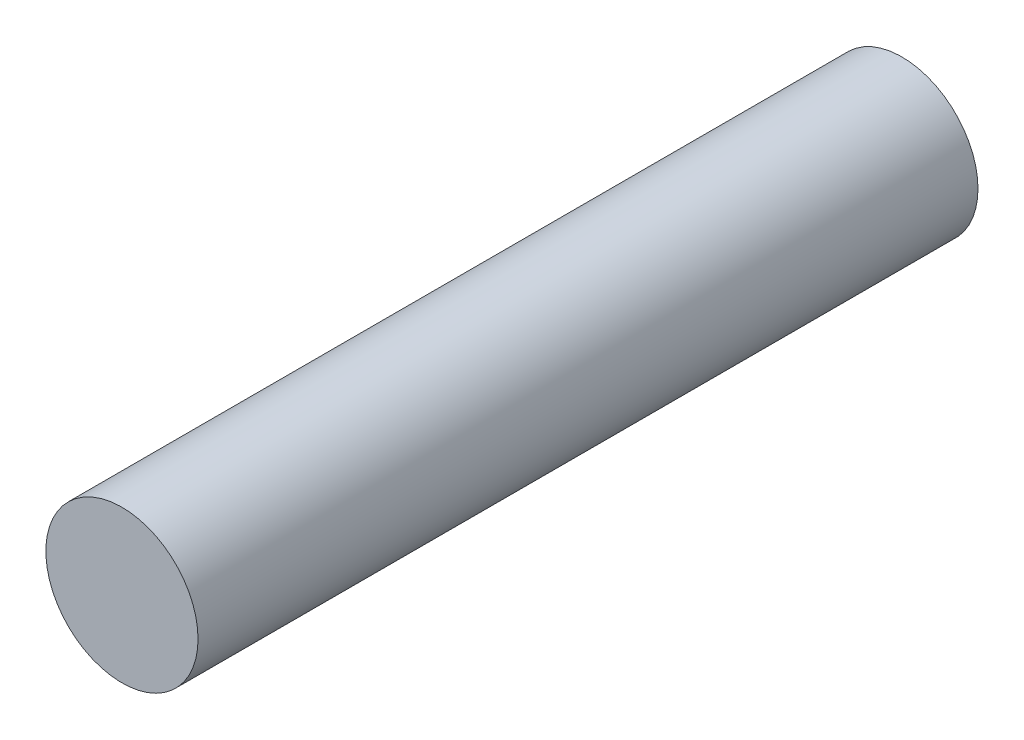
ISO-10303-21;
HEADER;
FILE_DESCRIPTION(('STEP AP214'),'2;1');
FILE_NAME('part.step','',(''),(''),'','','');
FILE_SCHEMA(('AUTOMOTIVE_DESIGN { 1 0 10303 214 1 1 1 1 }'));
ENDSEC;
DATA;
#1=APPLICATION_CONTEXT('core data for automotive mechanical design processes');
#2=APPLICATION_PROTOCOL_DEFINITION('international standard','automotive_design',2000,#1);
#3=PRODUCT_CONTEXT('',#1,'mechanical');
#4=PRODUCT('Part','Part','',(#3));
#5=PRODUCT_RELATED_PRODUCT_CATEGORY('part','',(#4));
#6=PRODUCT_DEFINITION_FORMATION('','',#4);
#7=PRODUCT_DEFINITION_CONTEXT('part definition',#1,'design');
#8=PRODUCT_DEFINITION('design','',#6,#7);
#9=PRODUCT_DEFINITION_SHAPE('','',#8);
#10=(LENGTH_UNIT() NAMED_UNIT(*) SI_UNIT(.MILLI.,.METRE.));
#11=(NAMED_UNIT(*) PLANE_ANGLE_UNIT() SI_UNIT($,.RADIAN.));
#12=(NAMED_UNIT(*) SI_UNIT($,.STERADIAN.) SOLID_ANGLE_UNIT());
#13=UNCERTAINTY_MEASURE_WITH_UNIT(LENGTH_MEASURE(1.E-05),#10,'distance_accuracy_value','');
#14=(GEOMETRIC_REPRESENTATION_CONTEXT(3) GLOBAL_UNCERTAINTY_ASSIGNED_CONTEXT((#13)) GLOBAL_UNIT_ASSIGNED_CONTEXT((#10,
#11,#12)) REPRESENTATION_CONTEXT('',''));
#15=CARTESIAN_POINT('',(0.,0.,0.));
#16=DIRECTION('',(0.,0.,1.));
#17=DIRECTION('',(1.,0.,0.));
#18=AXIS2_PLACEMENT_3D('',#15,#16,#17);
#19=CARTESIAN_POINT('',(0.,0.,20.5));
#20=DIRECTION('',(0.,0.,-1.));
#21=DIRECTION('',(-1.,0.,0.));
#22=AXIS2_PLACEMENT_3D('',#19,#20,#21);
#23=CYLINDRICAL_SURFACE('',#22,2.);
#24=CARTESIAN_POINT('',(0.,0.,20.5));
#25=DIRECTION('',(0.,0.,1.));
#26=DIRECTION('',(1.,0.,0.));
#27=AXIS2_PLACEMENT_3D('',#24,#25,#26);
#28=CIRCLE('',#27,2.);
#29=CARTESIAN_POINT('',(2.,0.,20.5));
#30=VERTEX_POINT('',#29);
#31=EDGE_CURVE('E10',#30,#30,#28,.T.);
#32=ORIENTED_EDGE('',*,*,#31,.F.);
#33=EDGE_LOOP('',(#32));
#34=FACE_BOUND('',#33,.T.);
#35=CARTESIAN_POINT('',(0.,0.,0.));
#36=DIRECTION('',(0.,0.,1.));
#37=DIRECTION('',(1.,0.,0.));
#38=AXIS2_PLACEMENT_3D('',#35,#36,#37);
#39=CIRCLE('',#38,2.);
#40=CARTESIAN_POINT('',(2.,0.,0.));
#41=VERTEX_POINT('',#40);
#42=EDGE_CURVE('E40',#41,#41,#39,.T.);
#43=ORIENTED_EDGE('',*,*,#42,.T.);
#44=EDGE_LOOP('',(#43));
#45=FACE_BOUND('',#44,.T.);
#46=ADVANCED_FACE('F37',(#34,#45),#23,.T.);
#47=CARTESIAN_POINT('',(0.,0.,20.5));
#48=DIRECTION('',(0.,0.,1.));
#49=DIRECTION('',(1.,0.,0.));
#50=AXIS2_PLACEMENT_3D('',#47,#48,#49);
#51=PLANE('',#50);
#52=ORIENTED_EDGE('',*,*,#31,.T.);
#53=EDGE_LOOP('',(#52));
#54=FACE_BOUND('',#53,.T.);
#55=ADVANCED_FACE('F52',(#54),#51,.T.);
#56=CARTESIAN_POINT('',(0.,0.,0.));
#57=DIRECTION('',(0.,0.,1.));
#58=DIRECTION('',(1.,0.,0.));
#59=AXIS2_PLACEMENT_3D('',#56,#57,#58);
#60=PLANE('',#59);
#61=ORIENTED_EDGE('',*,*,#42,.F.);
#62=EDGE_LOOP('',(#61));
#63=FACE_BOUND('',#62,.T.);
#64=ADVANCED_FACE('F50',(#63),#60,.F.);
#65=CLOSED_SHELL('',(#46,#55,#64));
#66=MANIFOLD_SOLID_BREP('B2',#65);
#67=ADVANCED_BREP_SHAPE_REPRESENTATION('',(#18,#66),#14);
#68=SHAPE_DEFINITION_REPRESENTATION(#9,#67);
ENDSEC;
END-ISO-10303-21;
